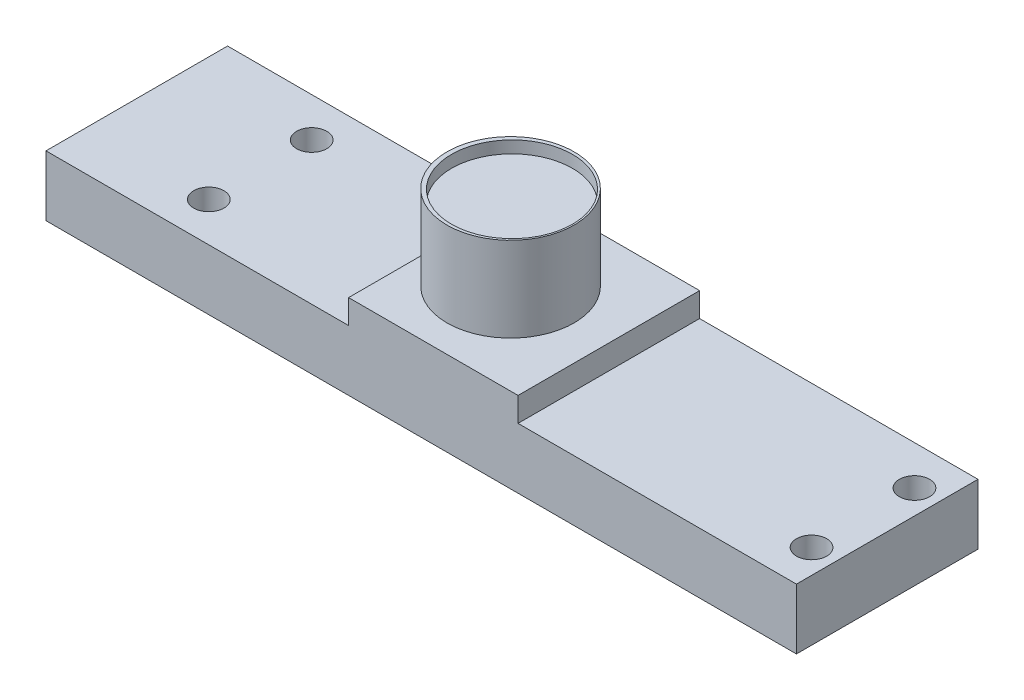
ISO-10303-21;
HEADER;
FILE_DESCRIPTION(('STEP AP214'),'2;1');
FILE_NAME('part.step','',(''),(''),'','','');
FILE_SCHEMA(('AUTOMOTIVE_DESIGN { 1 0 10303 214 1 1 1 1 }'));
ENDSEC;
DATA;
#1=APPLICATION_CONTEXT('core data for automotive mechanical design processes');
#2=APPLICATION_PROTOCOL_DEFINITION('international standard','automotive_design',2000,#1);
#3=PRODUCT_CONTEXT('',#1,'mechanical');
#4=PRODUCT('Part','Part','',(#3));
#5=PRODUCT_RELATED_PRODUCT_CATEGORY('part','',(#4));
#6=PRODUCT_DEFINITION_FORMATION('','',#4);
#7=PRODUCT_DEFINITION_CONTEXT('part definition',#1,'design');
#8=PRODUCT_DEFINITION('design','',#6,#7);
#9=PRODUCT_DEFINITION_SHAPE('','',#8);
#10=(LENGTH_UNIT() NAMED_UNIT(*) SI_UNIT(.MILLI.,.METRE.));
#11=(NAMED_UNIT(*) PLANE_ANGLE_UNIT() SI_UNIT($,.RADIAN.));
#12=(NAMED_UNIT(*) SI_UNIT($,.STERADIAN.) SOLID_ANGLE_UNIT());
#13=UNCERTAINTY_MEASURE_WITH_UNIT(LENGTH_MEASURE(1.E-05),#10,'distance_accuracy_value','');
#14=(GEOMETRIC_REPRESENTATION_CONTEXT(3) GLOBAL_UNCERTAINTY_ASSIGNED_CONTEXT((#13)) GLOBAL_UNIT_ASSIGNED_CONTEXT((#10,
#11,#12)) REPRESENTATION_CONTEXT('',''));
#15=CARTESIAN_POINT('',(0.,0.,0.));
#16=DIRECTION('',(0.,0.,1.));
#17=DIRECTION('',(1.,0.,0.));
#18=AXIS2_PLACEMENT_3D('',#15,#16,#17);
#19=CARTESIAN_POINT('',(0.,5.,0.));
#20=DIRECTION('',(0.,-1.,0.));
#21=DIRECTION('',(0.,0.,-1.));
#22=AXIS2_PLACEMENT_3D('',#19,#20,#21);
#23=PLANE('',#22);
#24=CARTESIAN_POINT('',(-20.8,5.,-4.25));
#25=DIRECTION('',(0.,1.,0.));
#26=DIRECTION('',(0.,0.,1.));
#27=AXIS2_PLACEMENT_3D('',#24,#25,#26);
#28=CIRCLE('',#27,1.25);
#29=CARTESIAN_POINT('',(-20.8,5.,-3.));
#30=VERTEX_POINT('',#29);
#31=EDGE_CURVE('E231',#30,#30,#28,.T.);
#32=ORIENTED_EDGE('',*,*,#31,.F.);
#33=EDGE_LOOP('',(#32));
#34=FACE_BOUND('',#33,.T.);
#35=CARTESIAN_POINT('',(-20.8,5.,4.25));
#36=DIRECTION('',(0.,1.,0.));
#37=DIRECTION('',(0.,0.,1.));
#38=AXIS2_PLACEMENT_3D('',#35,#36,#37);
#39=CIRCLE('',#38,1.25);
#40=CARTESIAN_POINT('',(-20.8,5.,5.5));
#41=VERTEX_POINT('',#40);
#42=EDGE_CURVE('E222',#41,#41,#39,.T.);
#43=ORIENTED_EDGE('',*,*,#42,.F.);
#44=EDGE_LOOP('',(#43));
#45=FACE_BOUND('',#44,.T.);
#46=DIRECTION('',(0.,0.,1.));
#47=VECTOR('',#46,1.);
#48=CARTESIAN_POINT('',(-6.,5.,0.));
#49=LINE('',#48,#47);
#50=CARTESIAN_POINT('',(-5.99999999999999,5.,-7.5));
#51=VERTEX_POINT('',#50);
#52=CARTESIAN_POINT('',(-6.,5.,7.5));
#53=VERTEX_POINT('',#52);
#54=EDGE_CURVE('E213',#51,#53,#49,.T.);
#55=ORIENTED_EDGE('',*,*,#54,.F.);
#56=DIRECTION('',(1.,0.,0.));
#57=VECTOR('',#56,1.);
#58=CARTESIAN_POINT('',(-31.,5.,-7.5));
#59=LINE('',#58,#57);
#60=CARTESIAN_POINT('',(-31.,5.,-7.5));
#61=VERTEX_POINT('',#60);
#62=EDGE_CURVE('E248',#61,#51,#59,.T.);
#63=ORIENTED_EDGE('',*,*,#62,.F.);
#64=DIRECTION('',(0.,0.,1.));
#65=VECTOR('',#64,1.);
#66=CARTESIAN_POINT('',(-31.,5.,-7.5));
#67=LINE('',#66,#65);
#68=CARTESIAN_POINT('',(-31.,5.,7.5));
#69=VERTEX_POINT('',#68);
#70=EDGE_CURVE('E253',#61,#69,#67,.T.);
#71=ORIENTED_EDGE('',*,*,#70,.T.);
#72=DIRECTION('',(1.,0.,0.));
#73=VECTOR('',#72,1.);
#74=CARTESIAN_POINT('',(-31.,5.,7.5));
#75=LINE('',#74,#73);
#76=EDGE_CURVE('E241',#69,#53,#75,.T.);
#77=ORIENTED_EDGE('',*,*,#76,.T.);
#78=EDGE_LOOP('',(#55,#63,#71,#77));
#79=FACE_BOUND('',#78,.T.);
#80=ADVANCED_FACE('F53',(#34,#45,#79),#23,.F.);
#81=CARTESIAN_POINT('',(29.,5.,4.25));
#82=DIRECTION('',(0.,1.,0.));
#83=DIRECTION('',(0.,0.,1.));
#84=AXIS2_PLACEMENT_3D('',#81,#82,#83);
#85=CIRCLE('',#84,1.25);
#86=CARTESIAN_POINT('',(29.,5.,5.50000000000001));
#87=VERTEX_POINT('',#86);
#88=EDGE_CURVE('E227',#87,#87,#85,.T.);
#89=ORIENTED_EDGE('',*,*,#88,.F.);
#90=EDGE_LOOP('',(#89));
#91=FACE_BOUND('',#90,.T.);
#92=CARTESIAN_POINT('',(29.,5.,-4.25));
#93=DIRECTION('',(0.,1.,0.));
#94=DIRECTION('',(0.,0.,1.));
#95=AXIS2_PLACEMENT_3D('',#92,#93,#94);
#96=CIRCLE('',#95,1.25);
#97=CARTESIAN_POINT('',(29.,5.,-3.));
#98=VERTEX_POINT('',#97);
#99=EDGE_CURVE('E216',#98,#98,#96,.T.);
#100=ORIENTED_EDGE('',*,*,#99,.F.);
#101=EDGE_LOOP('',(#100));
#102=FACE_BOUND('',#101,.T.);
#103=DIRECTION('',(0.,0.,-1.));
#104=VECTOR('',#103,1.);
#105=CARTESIAN_POINT('',(8.,5.,0.));
#106=LINE('',#105,#104);
#107=CARTESIAN_POINT('',(8.00000000000001,5.,7.5));
#108=VERTEX_POINT('',#107);
#109=CARTESIAN_POINT('',(8.,5.,-7.5));
#110=VERTEX_POINT('',#109);
#111=EDGE_CURVE('E79',#108,#110,#106,.T.);
#112=ORIENTED_EDGE('',*,*,#111,.F.);
#113=CARTESIAN_POINT('',(31.,5.,7.5));
#114=VERTEX_POINT('',#113);
#115=EDGE_CURVE('E243',#108,#114,#75,.T.);
#116=ORIENTED_EDGE('',*,*,#115,.T.);
#117=DIRECTION('',(0.,0.,1.));
#118=VECTOR('',#117,1.);
#119=CARTESIAN_POINT('',(31.,5.,-7.5));
#120=LINE('',#119,#118);
#121=CARTESIAN_POINT('',(31.,5.,-7.5));
#122=VERTEX_POINT('',#121);
#123=EDGE_CURVE('E244',#122,#114,#120,.T.);
#124=ORIENTED_EDGE('',*,*,#123,.F.);
#125=EDGE_CURVE('E250',#110,#122,#59,.T.);
#126=ORIENTED_EDGE('',*,*,#125,.F.);
#127=EDGE_LOOP('',(#112,#116,#124,#126));
#128=FACE_BOUND('',#127,.T.);
#129=ADVANCED_FACE('F305',(#91,#102,#128),#23,.F.);
#130=CARTESIAN_POINT('',(0.,0.,0.));
#131=DIRECTION('',(0.,-1.,0.));
#132=DIRECTION('',(0.,0.,-1.));
#133=AXIS2_PLACEMENT_3D('',#130,#131,#132);
#134=PLANE('',#133);
#135=DIRECTION('',(0.,0.,1.));
#136=VECTOR('',#135,1.);
#137=CARTESIAN_POINT('',(31.,0.,-7.5));
#138=LINE('',#137,#136);
#139=CARTESIAN_POINT('',(31.,0.,-7.5));
#140=VERTEX_POINT('',#139);
#141=CARTESIAN_POINT('',(31.,0.,7.5));
#142=VERTEX_POINT('',#141);
#143=EDGE_CURVE('E254',#140,#142,#138,.T.);
#144=ORIENTED_EDGE('',*,*,#143,.T.);
#145=DIRECTION('',(1.,0.,0.));
#146=VECTOR('',#145,1.);
#147=CARTESIAN_POINT('',(-31.,0.,7.5));
#148=LINE('',#147,#146);
#149=CARTESIAN_POINT('',(-31.,0.,7.5));
#150=VERTEX_POINT('',#149);
#151=EDGE_CURVE('E236',#150,#142,#148,.T.);
#152=ORIENTED_EDGE('',*,*,#151,.F.);
#153=DIRECTION('',(0.,0.,1.));
#154=VECTOR('',#153,1.);
#155=CARTESIAN_POINT('',(-31.,0.,-7.5));
#156=LINE('',#155,#154);
#157=CARTESIAN_POINT('',(-31.,0.,-7.5));
#158=VERTEX_POINT('',#157);
#159=EDGE_CURVE('E257',#158,#150,#156,.T.);
#160=ORIENTED_EDGE('',*,*,#159,.F.);
#161=DIRECTION('',(1.,0.,0.));
#162=VECTOR('',#161,1.);
#163=CARTESIAN_POINT('',(-31.,0.,-7.5));
#164=LINE('',#163,#162);
#165=EDGE_CURVE('E256',#158,#140,#164,.T.);
#166=ORIENTED_EDGE('',*,*,#165,.T.);
#167=EDGE_LOOP('',(#144,#152,#160,#166));
#168=FACE_BOUND('',#167,.T.);
#169=CARTESIAN_POINT('',(29.,0.,4.25));
#170=DIRECTION('',(0.,1.,0.));
#171=DIRECTION('',(0.,0.,1.));
#172=AXIS2_PLACEMENT_3D('',#169,#170,#171);
#173=CIRCLE('',#172,1.25);
#174=CARTESIAN_POINT('',(29.,0.,5.50000000000001));
#175=VERTEX_POINT('',#174);
#176=EDGE_CURVE('E221',#175,#175,#173,.T.);
#177=ORIENTED_EDGE('',*,*,#176,.T.);
#178=EDGE_LOOP('',(#177));
#179=FACE_BOUND('',#178,.T.);
#180=CARTESIAN_POINT('',(29.,0.,-4.25));
#181=DIRECTION('',(0.,1.,0.));
#182=DIRECTION('',(0.,0.,1.));
#183=AXIS2_PLACEMENT_3D('',#180,#181,#182);
#184=CIRCLE('',#183,1.25);
#185=CARTESIAN_POINT('',(29.,0.,-3.));
#186=VERTEX_POINT('',#185);
#187=EDGE_CURVE('E230',#186,#186,#184,.T.);
#188=ORIENTED_EDGE('',*,*,#187,.T.);
#189=EDGE_LOOP('',(#188));
#190=FACE_BOUND('',#189,.T.);
#191=CARTESIAN_POINT('',(-20.8,0.,-4.25));
#192=DIRECTION('',(0.,1.,0.));
#193=DIRECTION('',(0.,0.,1.));
#194=AXIS2_PLACEMENT_3D('',#191,#192,#193);
#195=CIRCLE('',#194,1.25);
#196=CARTESIAN_POINT('',(-20.8,0.,-3.));
#197=VERTEX_POINT('',#196);
#198=EDGE_CURVE('E219',#197,#197,#195,.T.);
#199=ORIENTED_EDGE('',*,*,#198,.T.);
#200=EDGE_LOOP('',(#199));
#201=FACE_BOUND('',#200,.T.);
#202=CARTESIAN_POINT('',(-20.8,0.,4.25));
#203=DIRECTION('',(0.,1.,0.));
#204=DIRECTION('',(0.,0.,1.));
#205=AXIS2_PLACEMENT_3D('',#202,#203,#204);
#206=CIRCLE('',#205,1.25);
#207=CARTESIAN_POINT('',(-20.8,0.,5.5));
#208=VERTEX_POINT('',#207);
#209=EDGE_CURVE('E220',#208,#208,#206,.T.);
#210=ORIENTED_EDGE('',*,*,#209,.T.);
#211=EDGE_LOOP('',(#210));
#212=FACE_BOUND('',#211,.T.);
#213=ADVANCED_FACE('F279',(#168,#179,#190,#201,#212),#134,.T.);
#214=CARTESIAN_POINT('',(-31.,5.,7.5));
#215=DIRECTION('',(0.,0.,-1.));
#216=DIRECTION('',(-1.,0.,0.));
#217=AXIS2_PLACEMENT_3D('',#214,#215,#216);
#218=PLANE('',#217);
#219=ORIENTED_EDGE('',*,*,#115,.F.);
#220=DIRECTION('',(0.,-1.,0.));
#221=VECTOR('',#220,1.);
#222=CARTESIAN_POINT('',(8.,7.,7.5));
#223=LINE('',#222,#221);
#224=CARTESIAN_POINT('',(8.,7.,7.5));
#225=VERTEX_POINT('',#224);
#226=EDGE_CURVE('E201',#225,#108,#223,.T.);
#227=ORIENTED_EDGE('',*,*,#226,.F.);
#228=DIRECTION('',(1.,0.,0.));
#229=VECTOR('',#228,1.);
#230=CARTESIAN_POINT('',(-6.,7.,7.5));
#231=LINE('',#230,#229);
#232=CARTESIAN_POINT('',(-6.,7.,7.5));
#233=VERTEX_POINT('',#232);
#234=EDGE_CURVE('E198',#233,#225,#231,.T.);
#235=ORIENTED_EDGE('',*,*,#234,.F.);
#236=DIRECTION('',(0.,-1.,0.));
#237=VECTOR('',#236,1.);
#238=CARTESIAN_POINT('',(-6.,7.,7.5));
#239=LINE('',#238,#237);
#240=EDGE_CURVE('E206',#233,#53,#239,.T.);
#241=ORIENTED_EDGE('',*,*,#240,.T.);
#242=ORIENTED_EDGE('',*,*,#76,.F.);
#243=DIRECTION('',(0.,-1.,0.));
#244=VECTOR('',#243,1.);
#245=CARTESIAN_POINT('',(-31.,5.,7.5));
#246=LINE('',#245,#244);
#247=EDGE_CURVE('E251',#69,#150,#246,.T.);
#248=ORIENTED_EDGE('',*,*,#247,.T.);
#249=ORIENTED_EDGE('',*,*,#151,.T.);
#250=DIRECTION('',(0.,-1.,0.));
#251=VECTOR('',#250,1.);
#252=CARTESIAN_POINT('',(31.,5.,7.5));
#253=LINE('',#252,#251);
#254=EDGE_CURVE('E12',#114,#142,#253,.T.);
#255=ORIENTED_EDGE('',*,*,#254,.F.);
#256=EDGE_LOOP('',(#219,#227,#235,#241,#242,#248,#249,#255));
#257=FACE_BOUND('',#256,.T.);
#258=ADVANCED_FACE('F57',(#257),#218,.F.);
#259=CARTESIAN_POINT('',(31.,5.,-7.5));
#260=DIRECTION('',(1.,0.,0.));
#261=DIRECTION('',(0.,0.,-1.));
#262=AXIS2_PLACEMENT_3D('',#259,#260,#261);
#263=PLANE('',#262);
#264=ORIENTED_EDGE('',*,*,#143,.F.);
#265=DIRECTION('',(0.,-1.,0.));
#266=VECTOR('',#265,1.);
#267=CARTESIAN_POINT('',(31.,5.,-7.5));
#268=LINE('',#267,#266);
#269=EDGE_CURVE('E64',#122,#140,#268,.T.);
#270=ORIENTED_EDGE('',*,*,#269,.F.);
#271=ORIENTED_EDGE('',*,*,#123,.T.);
#272=ORIENTED_EDGE('',*,*,#254,.T.);
#273=EDGE_LOOP('',(#264,#270,#271,#272));
#274=FACE_BOUND('',#273,.T.);
#275=ADVANCED_FACE('F273',(#274),#263,.T.);
#276=CARTESIAN_POINT('',(-31.,5.,-7.5));
#277=DIRECTION('',(0.,0.,-1.));
#278=DIRECTION('',(-1.,0.,0.));
#279=AXIS2_PLACEMENT_3D('',#276,#277,#278);
#280=PLANE('',#279);
#281=ORIENTED_EDGE('',*,*,#269,.T.);
#282=ORIENTED_EDGE('',*,*,#165,.F.);
#283=DIRECTION('',(0.,-1.,0.));
#284=VECTOR('',#283,1.);
#285=CARTESIAN_POINT('',(-31.,5.,-7.5));
#286=LINE('',#285,#284);
#287=EDGE_CURVE('E262',#61,#158,#286,.T.);
#288=ORIENTED_EDGE('',*,*,#287,.F.);
#289=ORIENTED_EDGE('',*,*,#62,.T.);
#290=DIRECTION('',(0.,-1.,0.));
#291=VECTOR('',#290,1.);
#292=CARTESIAN_POINT('',(-6.,7.,-7.5));
#293=LINE('',#292,#291);
#294=CARTESIAN_POINT('',(-6.,7.,-7.5));
#295=VERTEX_POINT('',#294);
#296=EDGE_CURVE('E207',#295,#51,#293,.T.);
#297=ORIENTED_EDGE('',*,*,#296,.F.);
#298=DIRECTION('',(-1.,0.,0.));
#299=VECTOR('',#298,1.);
#300=CARTESIAN_POINT('',(8.,7.,-7.5));
#301=LINE('',#300,#299);
#302=CARTESIAN_POINT('',(8.,7.,-7.5));
#303=VERTEX_POINT('',#302);
#304=EDGE_CURVE('E192',#303,#295,#301,.T.);
#305=ORIENTED_EDGE('',*,*,#304,.F.);
#306=DIRECTION('',(0.,-1.,0.));
#307=VECTOR('',#306,1.);
#308=CARTESIAN_POINT('',(8.,7.,-7.5));
#309=LINE('',#308,#307);
#310=EDGE_CURVE('E199',#303,#110,#309,.T.);
#311=ORIENTED_EDGE('',*,*,#310,.T.);
#312=ORIENTED_EDGE('',*,*,#125,.T.);
#313=EDGE_LOOP('',(#281,#282,#288,#289,#297,#305,#311,#312));
#314=FACE_BOUND('',#313,.T.);
#315=ADVANCED_FACE('F271',(#314),#280,.T.);
#316=CARTESIAN_POINT('',(-31.,5.,-7.5));
#317=DIRECTION('',(1.,0.,0.));
#318=DIRECTION('',(0.,0.,-1.));
#319=AXIS2_PLACEMENT_3D('',#316,#317,#318);
#320=PLANE('',#319);
#321=DIRECTION('',(0.,0.,-1.));
#322=VECTOR('',#321,1.);
#323=CARTESIAN_POINT('',(-31.,4.75,-6.));
#324=LINE('',#323,#322);
#325=CARTESIAN_POINT('',(-31.,4.75,6.));
#326=VERTEX_POINT('',#325);
#327=CARTESIAN_POINT('',(-31.,4.75,-6.));
#328=VERTEX_POINT('',#327);
#329=EDGE_CURVE('E174',#326,#328,#324,.T.);
#330=ORIENTED_EDGE('',*,*,#329,.F.);
#331=DIRECTION('',(0.,1.,0.));
#332=VECTOR('',#331,1.);
#333=CARTESIAN_POINT('',(-31.,4.75,6.));
#334=LINE('',#333,#332);
#335=CARTESIAN_POINT('',(-31.,0.25,6.));
#336=VERTEX_POINT('',#335);
#337=EDGE_CURVE('E66',#336,#326,#334,.T.);
#338=ORIENTED_EDGE('',*,*,#337,.F.);
#339=DIRECTION('',(0.,0.,1.));
#340=VECTOR('',#339,1.);
#341=CARTESIAN_POINT('',(-31.,0.25,-6.));
#342=LINE('',#341,#340);
#343=CARTESIAN_POINT('',(-31.,0.25,-6.));
#344=VERTEX_POINT('',#343);
#345=EDGE_CURVE('E163',#344,#336,#342,.T.);
#346=ORIENTED_EDGE('',*,*,#345,.F.);
#347=DIRECTION('',(0.,-1.,0.));
#348=VECTOR('',#347,1.);
#349=CARTESIAN_POINT('',(-31.,4.75,-6.));
#350=LINE('',#349,#348);
#351=EDGE_CURVE('E170',#328,#344,#350,.T.);
#352=ORIENTED_EDGE('',*,*,#351,.F.);
#353=EDGE_LOOP('',(#330,#338,#346,#352));
#354=FACE_BOUND('',#353,.T.);
#355=ORIENTED_EDGE('',*,*,#159,.T.);
#356=ORIENTED_EDGE('',*,*,#247,.F.);
#357=ORIENTED_EDGE('',*,*,#70,.F.);
#358=ORIENTED_EDGE('',*,*,#287,.T.);
#359=EDGE_LOOP('',(#355,#356,#357,#358));
#360=FACE_BOUND('',#359,.T.);
#361=ADVANCED_FACE('F284',(#354,#360),#320,.F.);
#362=CARTESIAN_POINT('',(-20.8,5.,-4.25));
#363=DIRECTION('',(0.,-1.,0.));
#364=DIRECTION('',(0.,0.,-1.));
#365=AXIS2_PLACEMENT_3D('',#362,#363,#364);
#366=CYLINDRICAL_SURFACE('',#365,1.25);
#367=ORIENTED_EDGE('',*,*,#31,.T.);
#368=EDGE_LOOP('',(#367));
#369=FACE_BOUND('',#368,.T.);
#370=ORIENTED_EDGE('',*,*,#198,.F.);
#371=EDGE_LOOP('',(#370));
#372=FACE_BOUND('',#371,.T.);
#373=ADVANCED_FACE('F316',(#369,#372),#366,.F.);
#374=CARTESIAN_POINT('',(-20.8,5.,4.25));
#375=DIRECTION('',(0.,-1.,0.));
#376=DIRECTION('',(0.,0.,-1.));
#377=AXIS2_PLACEMENT_3D('',#374,#375,#376);
#378=CYLINDRICAL_SURFACE('',#377,1.25);
#379=ORIENTED_EDGE('',*,*,#42,.T.);
#380=EDGE_LOOP('',(#379));
#381=FACE_BOUND('',#380,.T.);
#382=ORIENTED_EDGE('',*,*,#209,.F.);
#383=EDGE_LOOP('',(#382));
#384=FACE_BOUND('',#383,.T.);
#385=ADVANCED_FACE('F481',(#381,#384),#378,.F.);
#386=CARTESIAN_POINT('',(29.,5.,4.25));
#387=DIRECTION('',(0.,-1.,0.));
#388=DIRECTION('',(0.,0.,-1.));
#389=AXIS2_PLACEMENT_3D('',#386,#387,#388);
#390=CYLINDRICAL_SURFACE('',#389,1.25);
#391=ORIENTED_EDGE('',*,*,#88,.T.);
#392=EDGE_LOOP('',(#391));
#393=FACE_BOUND('',#392,.T.);
#394=ORIENTED_EDGE('',*,*,#176,.F.);
#395=EDGE_LOOP('',(#394));
#396=FACE_BOUND('',#395,.T.);
#397=ADVANCED_FACE('F471',(#393,#396),#390,.F.);
#398=CARTESIAN_POINT('',(29.,5.,-4.25));
#399=DIRECTION('',(0.,-1.,0.));
#400=DIRECTION('',(0.,0.,-1.));
#401=AXIS2_PLACEMENT_3D('',#398,#399,#400);
#402=CYLINDRICAL_SURFACE('',#401,1.25);
#403=ORIENTED_EDGE('',*,*,#99,.T.);
#404=EDGE_LOOP('',(#403));
#405=FACE_BOUND('',#404,.T.);
#406=ORIENTED_EDGE('',*,*,#187,.F.);
#407=EDGE_LOOP('',(#406));
#408=FACE_BOUND('',#407,.T.);
#409=ADVANCED_FACE('F345',(#405,#408),#402,.F.);
#410=CARTESIAN_POINT('',(-6.,7.,-7.5));
#411=DIRECTION('',(1.,0.,0.));
#412=DIRECTION('',(0.,0.,-1.));
#413=AXIS2_PLACEMENT_3D('',#410,#411,#412);
#414=PLANE('',#413);
#415=ORIENTED_EDGE('',*,*,#296,.T.);
#416=ORIENTED_EDGE('',*,*,#54,.T.);
#417=ORIENTED_EDGE('',*,*,#240,.F.);
#418=DIRECTION('',(0.,0.,1.));
#419=VECTOR('',#418,1.);
#420=CARTESIAN_POINT('',(-6.,7.,-7.5));
#421=LINE('',#420,#419);
#422=EDGE_CURVE('E194',#295,#233,#421,.T.);
#423=ORIENTED_EDGE('',*,*,#422,.F.);
#424=EDGE_LOOP('',(#415,#416,#417,#423));
#425=FACE_BOUND('',#424,.T.);
#426=ADVANCED_FACE('F295',(#425),#414,.F.);
#427=CARTESIAN_POINT('',(8.,7.,7.5));
#428=DIRECTION('',(-1.,0.,0.));
#429=DIRECTION('',(0.,0.,1.));
#430=AXIS2_PLACEMENT_3D('',#427,#428,#429);
#431=PLANE('',#430);
#432=ORIENTED_EDGE('',*,*,#226,.T.);
#433=ORIENTED_EDGE('',*,*,#111,.T.);
#434=ORIENTED_EDGE('',*,*,#310,.F.);
#435=DIRECTION('',(0.,0.,-1.));
#436=VECTOR('',#435,1.);
#437=CARTESIAN_POINT('',(8.,7.,7.5));
#438=LINE('',#437,#436);
#439=EDGE_CURVE('E196',#225,#303,#438,.T.);
#440=ORIENTED_EDGE('',*,*,#439,.F.);
#441=EDGE_LOOP('',(#432,#433,#434,#440));
#442=FACE_BOUND('',#441,.T.);
#443=ADVANCED_FACE('F302',(#442),#431,.F.);
#444=CARTESIAN_POINT('',(0.,7.,0.));
#445=DIRECTION('',(0.,1.,0.));
#446=DIRECTION('',(0.,0.,1.));
#447=AXIS2_PLACEMENT_3D('',#444,#445,#446);
#448=PLANE('',#447);
#449=CARTESIAN_POINT('',(-0.120000000000002,7.,0.));
#450=DIRECTION('',(0.,1.,0.));
#451=DIRECTION('',(0.,0.,1.));
#452=AXIS2_PLACEMENT_3D('',#449,#450,#451);
#453=CIRCLE('',#452,5.25);
#454=CARTESIAN_POINT('',(-0.120000000000002,7.,5.25));
#455=VERTEX_POINT('',#454);
#456=EDGE_CURVE('E59',#455,#455,#453,.F.);
#457=ORIENTED_EDGE('',*,*,#456,.T.);
#458=EDGE_LOOP('',(#457));
#459=FACE_BOUND('',#458,.T.);
#460=ORIENTED_EDGE('',*,*,#304,.T.);
#461=ORIENTED_EDGE('',*,*,#422,.T.);
#462=ORIENTED_EDGE('',*,*,#234,.T.);
#463=ORIENTED_EDGE('',*,*,#439,.T.);
#464=EDGE_LOOP('',(#460,#461,#462,#463));
#465=FACE_BOUND('',#464,.T.);
#466=ADVANCED_FACE('F297',(#459,#465),#448,.T.);
#467=CARTESIAN_POINT('',(-0.120000000000002,14.,0.));
#468=DIRECTION('',(0.,-1.,0.));
#469=DIRECTION('',(0.,0.,-1.));
#470=AXIS2_PLACEMENT_3D('',#467,#468,#469);
#471=CYLINDRICAL_SURFACE('',#470,5.25);
#472=ORIENTED_EDGE('',*,*,#456,.F.);
#473=EDGE_LOOP('',(#472));
#474=FACE_BOUND('',#473,.T.);
#475=CARTESIAN_POINT('',(-0.120000000000002,14.,0.));
#476=DIRECTION('',(0.,1.,0.));
#477=DIRECTION('',(0.,0.,1.));
#478=AXIS2_PLACEMENT_3D('',#475,#476,#477);
#479=CIRCLE('',#478,5.25);
#480=CARTESIAN_POINT('',(-0.120000000000002,14.,5.25));
#481=VERTEX_POINT('',#480);
#482=EDGE_CURVE('E186',#481,#481,#479,.T.);
#483=ORIENTED_EDGE('',*,*,#482,.F.);
#484=EDGE_LOOP('',(#483));
#485=FACE_BOUND('',#484,.T.);
#486=ADVANCED_FACE('F362',(#474,#485),#471,.T.);
#487=CARTESIAN_POINT('',(-0.120000000000002,14.,0.));
#488=DIRECTION('',(0.,1.,0.));
#489=DIRECTION('',(0.,0.,1.));
#490=AXIS2_PLACEMENT_3D('',#487,#488,#489);
#491=PLANE('',#490);
#492=CARTESIAN_POINT('',(0.,14.,0.));
#493=DIRECTION('',(0.,1.,0.));
#494=DIRECTION('',(0.,0.,1.));
#495=AXIS2_PLACEMENT_3D('',#492,#493,#494);
#496=CIRCLE('',#495,5.);
#497=CARTESIAN_POINT('',(0.,14.,5.));
#498=VERTEX_POINT('',#497);
#499=EDGE_CURVE('E179',#498,#498,#496,.T.);
#500=ORIENTED_EDGE('',*,*,#499,.F.);
#501=EDGE_LOOP('',(#500));
#502=FACE_BOUND('',#501,.T.);
#503=ORIENTED_EDGE('',*,*,#482,.T.);
#504=EDGE_LOOP('',(#503));
#505=FACE_BOUND('',#504,.T.);
#506=ADVANCED_FACE('F371',(#502,#505),#491,.T.);
#507=CARTESIAN_POINT('',(0.,13.,0.));
#508=DIRECTION('',(0.,1.,0.));
#509=DIRECTION('',(0.,0.,1.));
#510=AXIS2_PLACEMENT_3D('',#507,#508,#509);
#511=CYLINDRICAL_SURFACE('',#510,5.);
#512=CARTESIAN_POINT('',(0.,13.,0.));
#513=DIRECTION('',(0.,1.,0.));
#514=DIRECTION('',(0.,0.,1.));
#515=AXIS2_PLACEMENT_3D('',#512,#513,#514);
#516=CIRCLE('',#515,5.);
#517=CARTESIAN_POINT('',(0.,13.,5.));
#518=VERTEX_POINT('',#517);
#519=EDGE_CURVE('E181',#518,#518,#516,.T.);
#520=ORIENTED_EDGE('',*,*,#519,.F.);
#521=EDGE_LOOP('',(#520));
#522=FACE_BOUND('',#521,.T.);
#523=ORIENTED_EDGE('',*,*,#499,.T.);
#524=EDGE_LOOP('',(#523));
#525=FACE_BOUND('',#524,.T.);
#526=ADVANCED_FACE('F379',(#522,#525),#511,.F.);
#527=CARTESIAN_POINT('',(0.,13.,0.));
#528=DIRECTION('',(0.,1.,0.));
#529=DIRECTION('',(0.,0.,1.));
#530=AXIS2_PLACEMENT_3D('',#527,#528,#529);
#531=PLANE('',#530);
#532=ORIENTED_EDGE('',*,*,#519,.T.);
#533=EDGE_LOOP('',(#532));
#534=FACE_BOUND('',#533,.T.);
#535=ADVANCED_FACE('F386',(#534),#531,.T.);
#536=CARTESIAN_POINT('',(-23.,4.75,6.));
#537=DIRECTION('',(0.,0.,1.));
#538=DIRECTION('',(1.,0.,0.));
#539=AXIS2_PLACEMENT_3D('',#536,#537,#538);
#540=PLANE('',#539);
#541=ORIENTED_EDGE('',*,*,#337,.T.);
#542=DIRECTION('',(-1.,0.,0.));
#543=VECTOR('',#542,1.);
#544=CARTESIAN_POINT('',(-23.,4.75,6.));
#545=LINE('',#544,#543);
#546=CARTESIAN_POINT('',(-23.,4.75,6.));
#547=VERTEX_POINT('',#546);
#548=EDGE_CURVE('E142',#547,#326,#545,.T.);
#549=ORIENTED_EDGE('',*,*,#548,.F.);
#550=DIRECTION('',(0.,1.,0.));
#551=VECTOR('',#550,1.);
#552=CARTESIAN_POINT('',(-23.,4.75,6.));
#553=LINE('',#552,#551);
#554=CARTESIAN_POINT('',(-23.,0.25,6.));
#555=VERTEX_POINT('',#554);
#556=EDGE_CURVE('E148',#555,#547,#553,.T.);
#557=ORIENTED_EDGE('',*,*,#556,.F.);
#558=DIRECTION('',(-1.,0.,0.));
#559=VECTOR('',#558,1.);
#560=CARTESIAN_POINT('',(-23.,0.25,6.));
#561=LINE('',#560,#559);
#562=EDGE_CURVE('E180',#555,#336,#561,.T.);
#563=ORIENTED_EDGE('',*,*,#562,.T.);
#564=EDGE_LOOP('',(#541,#549,#557,#563));
#565=FACE_BOUND('',#564,.T.);
#566=ADVANCED_FACE('F145',(#565),#540,.F.);
#567=CARTESIAN_POINT('',(-23.,0.25,-6.));
#568=DIRECTION('',(0.,-1.,0.));
#569=DIRECTION('',(0.,0.,-1.));
#570=AXIS2_PLACEMENT_3D('',#567,#568,#569);
#571=PLANE('',#570);
#572=ORIENTED_EDGE('',*,*,#345,.T.);
#573=ORIENTED_EDGE('',*,*,#562,.F.);
#574=DIRECTION('',(0.,0.,1.));
#575=VECTOR('',#574,1.);
#576=CARTESIAN_POINT('',(-23.,0.25,-6.));
#577=LINE('',#576,#575);
#578=CARTESIAN_POINT('',(-23.,0.25,-6.));
#579=VERTEX_POINT('',#578);
#580=EDGE_CURVE('E155',#579,#555,#577,.T.);
#581=ORIENTED_EDGE('',*,*,#580,.F.);
#582=DIRECTION('',(-1.,0.,0.));
#583=VECTOR('',#582,1.);
#584=CARTESIAN_POINT('',(-23.,0.25,-6.));
#585=LINE('',#584,#583);
#586=EDGE_CURVE('E176',#579,#344,#585,.T.);
#587=ORIENTED_EDGE('',*,*,#586,.T.);
#588=EDGE_LOOP('',(#572,#573,#581,#587));
#589=FACE_BOUND('',#588,.T.);
#590=ADVANCED_FACE('F415',(#589),#571,.F.);
#591=CARTESIAN_POINT('',(-23.,4.75,-6.));
#592=DIRECTION('',(0.,0.,-1.));
#593=DIRECTION('',(-1.,0.,0.));
#594=AXIS2_PLACEMENT_3D('',#591,#592,#593);
#595=PLANE('',#594);
#596=ORIENTED_EDGE('',*,*,#351,.T.);
#597=ORIENTED_EDGE('',*,*,#586,.F.);
#598=DIRECTION('',(0.,-1.,0.));
#599=VECTOR('',#598,1.);
#600=CARTESIAN_POINT('',(-23.,4.75,-6.));
#601=LINE('',#600,#599);
#602=CARTESIAN_POINT('',(-23.,4.75,-6.));
#603=VERTEX_POINT('',#602);
#604=EDGE_CURVE('E159',#603,#579,#601,.T.);
#605=ORIENTED_EDGE('',*,*,#604,.F.);
#606=DIRECTION('',(-1.,0.,0.));
#607=VECTOR('',#606,1.);
#608=CARTESIAN_POINT('',(-23.,4.75,-6.));
#609=LINE('',#608,#607);
#610=EDGE_CURVE('E151',#603,#328,#609,.T.);
#611=ORIENTED_EDGE('',*,*,#610,.T.);
#612=EDGE_LOOP('',(#596,#597,#605,#611));
#613=FACE_BOUND('',#612,.T.);
#614=ADVANCED_FACE('F419',(#613),#595,.F.);
#615=CARTESIAN_POINT('',(-23.,4.75,-6.));
#616=DIRECTION('',(0.,1.,0.));
#617=DIRECTION('',(0.,0.,1.));
#618=AXIS2_PLACEMENT_3D('',#615,#616,#617);
#619=PLANE('',#618);
#620=ORIENTED_EDGE('',*,*,#329,.T.);
#621=ORIENTED_EDGE('',*,*,#610,.F.);
#622=DIRECTION('',(0.,0.,-1.));
#623=VECTOR('',#622,1.);
#624=CARTESIAN_POINT('',(-23.,4.75,-6.));
#625=LINE('',#624,#623);
#626=EDGE_CURVE('E154',#547,#603,#625,.T.);
#627=ORIENTED_EDGE('',*,*,#626,.F.);
#628=ORIENTED_EDGE('',*,*,#548,.T.);
#629=EDGE_LOOP('',(#620,#621,#627,#628));
#630=FACE_BOUND('',#629,.T.);
#631=ADVANCED_FACE('F156',(#630),#619,.F.);
#632=CARTESIAN_POINT('',(-23.,0.,0.));
#633=DIRECTION('',(-1.,0.,0.));
#634=DIRECTION('',(0.,0.,1.));
#635=AXIS2_PLACEMENT_3D('',#632,#633,#634);
#636=PLANE('',#635);
#637=ORIENTED_EDGE('',*,*,#556,.T.);
#638=ORIENTED_EDGE('',*,*,#626,.T.);
#639=ORIENTED_EDGE('',*,*,#604,.T.);
#640=ORIENTED_EDGE('',*,*,#580,.T.);
#641=EDGE_LOOP('',(#637,#638,#639,#640));
#642=FACE_BOUND('',#641,.T.);
#643=ADVANCED_FACE('F165',(#642),#636,.T.);
#644=CLOSED_SHELL('',(#80,#129,#213,#258,#275,#315,#361,#373,#385,#397,#409,#426,#443,#466,#486,
#506,#526,#535,#566,#590,#614,#631,#643));
#645=MANIFOLD_SOLID_BREP('B2',#644);
#646=ADVANCED_BREP_SHAPE_REPRESENTATION('',(#18,#645),#14);
#647=SHAPE_DEFINITION_REPRESENTATION(#9,#646);
ENDSEC;
END-ISO-10303-21;
